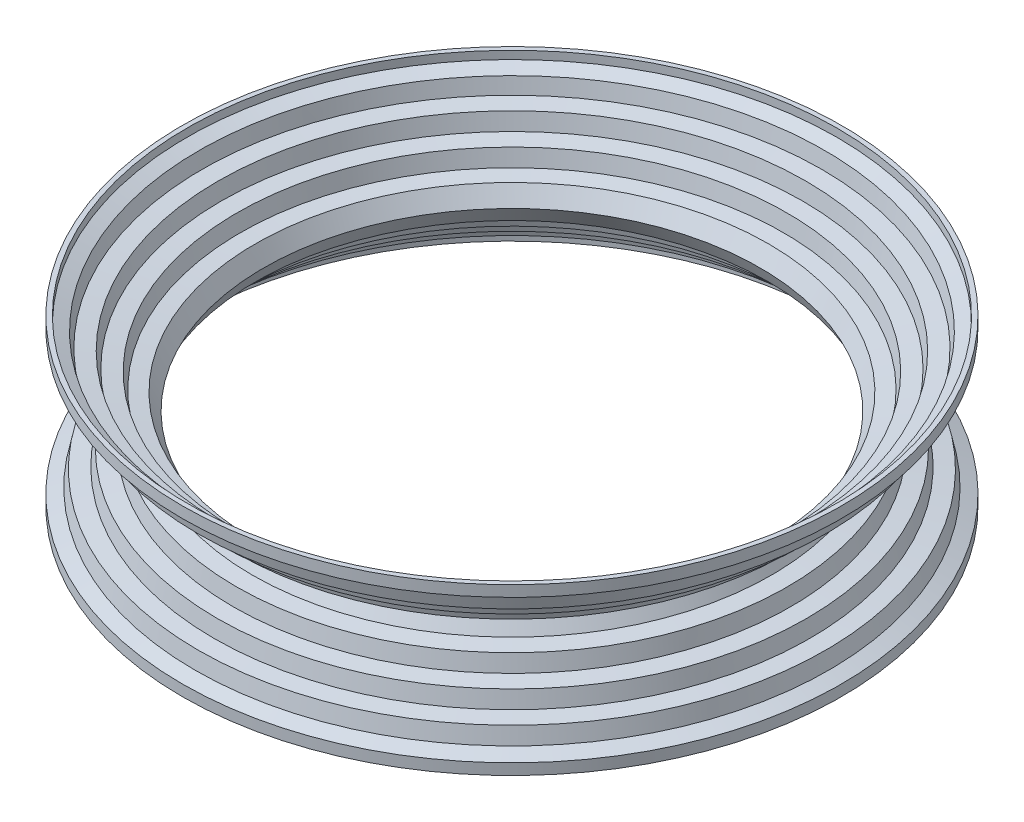
ISO-10303-21;
HEADER;
FILE_DESCRIPTION(('STEP AP214'),'2;1');
FILE_NAME('part.step','',(''),(''),'','','');
FILE_SCHEMA(('AUTOMOTIVE_DESIGN { 1 0 10303 214 1 1 1 1 }'));
ENDSEC;
DATA;
#1=APPLICATION_CONTEXT('core data for automotive mechanical design processes');
#2=APPLICATION_PROTOCOL_DEFINITION('international standard','automotive_design',2000,#1);
#3=PRODUCT_CONTEXT('',#1,'mechanical');
#4=PRODUCT('Part','Part','',(#3));
#5=PRODUCT_RELATED_PRODUCT_CATEGORY('part','',(#4));
#6=PRODUCT_DEFINITION_FORMATION('','',#4);
#7=PRODUCT_DEFINITION_CONTEXT('part definition',#1,'design');
#8=PRODUCT_DEFINITION('design','',#6,#7);
#9=PRODUCT_DEFINITION_SHAPE('','',#8);
#10=(LENGTH_UNIT() NAMED_UNIT(*) SI_UNIT(.MILLI.,.METRE.));
#11=(NAMED_UNIT(*) PLANE_ANGLE_UNIT() SI_UNIT($,.RADIAN.));
#12=(NAMED_UNIT(*) SI_UNIT($,.STERADIAN.) SOLID_ANGLE_UNIT());
#13=UNCERTAINTY_MEASURE_WITH_UNIT(LENGTH_MEASURE(1.E-05),#10,'distance_accuracy_value','');
#14=(GEOMETRIC_REPRESENTATION_CONTEXT(3) GLOBAL_UNCERTAINTY_ASSIGNED_CONTEXT((#13)) GLOBAL_UNIT_ASSIGNED_CONTEXT((#10,
#11,#12)) REPRESENTATION_CONTEXT('',''));
#15=CARTESIAN_POINT('',(0.,0.,0.));
#16=DIRECTION('',(0.,0.,1.));
#17=DIRECTION('',(1.,0.,0.));
#18=AXIS2_PLACEMENT_3D('',#15,#16,#17);
#19=CARTESIAN_POINT('',(0.,1.2,0.));
#20=DIRECTION('',(0.,-1.,0.));
#21=DIRECTION('',(0.,0.,-1.));
#22=AXIS2_PLACEMENT_3D('',#19,#20,#21);
#23=CYLINDRICAL_SURFACE('',#22,35.8938037049019);
#24=CARTESIAN_POINT('',(0.,1.2,0.));
#25=DIRECTION('',(0.,1.,0.));
#26=DIRECTION('',(0.,0.,1.));
#27=AXIS2_PLACEMENT_3D('',#24,#25,#26);
#28=CIRCLE('',#27,35.8938037049019);
#29=CARTESIAN_POINT('',(0.,1.2,35.8938037049019));
#30=VERTEX_POINT('',#29);
#31=EDGE_CURVE('E10',#30,#30,#28,.T.);
#32=ORIENTED_EDGE('',*,*,#31,.F.);
#33=EDGE_LOOP('',(#32));
#34=FACE_BOUND('',#33,.T.);
#35=CARTESIAN_POINT('',(0.,0.,0.));
#36=DIRECTION('',(0.,1.,0.));
#37=DIRECTION('',(0.,0.,1.));
#38=AXIS2_PLACEMENT_3D('',#35,#36,#37);
#39=CIRCLE('',#38,35.8938037049019);
#40=CARTESIAN_POINT('',(0.,0.,35.8938037049019));
#41=VERTEX_POINT('',#40);
#42=EDGE_CURVE('E42',#41,#41,#39,.T.);
#43=ORIENTED_EDGE('',*,*,#42,.T.);
#44=EDGE_LOOP('',(#43));
#45=FACE_BOUND('',#44,.T.);
#46=ADVANCED_FACE('F39',(#34,#45),#23,.T.);
#47=CARTESIAN_POINT('',(0.,0.,0.));
#48=DIRECTION('',(0.,1.,0.));
#49=DIRECTION('',(0.,0.,1.));
#50=AXIS2_PLACEMENT_3D('',#47,#48,#49);
#51=PLANE('',#50);
#52=CARTESIAN_POINT('',(0.,0.,0.));
#53=DIRECTION('',(0.,1.,0.));
#54=DIRECTION('',(0.,0.,1.));
#55=AXIS2_PLACEMENT_3D('',#52,#53,#54);
#56=CIRCLE('',#55,35.3938037049019);
#57=CARTESIAN_POINT('',(0.,0.,35.3938037049019));
#58=VERTEX_POINT('',#57);
#59=EDGE_CURVE('E127',#58,#58,#56,.T.);
#60=ORIENTED_EDGE('',*,*,#59,.T.);
#61=EDGE_LOOP('',(#60));
#62=FACE_BOUND('',#61,.T.);
#63=ORIENTED_EDGE('',*,*,#42,.F.);
#64=EDGE_LOOP('',(#63));
#65=FACE_BOUND('',#64,.T.);
#66=ADVANCED_FACE('F217',(#62,#65),#51,.F.);
#67=CARTESIAN_POINT('',(0.,7.66437557558971,0.));
#68=DIRECTION('',(0.,-1.,0.));
#69=DIRECTION('',(0.,0.,-1.));
#70=AXIS2_PLACEMENT_3D('',#67,#68,#69);
#71=CONICAL_SURFACE('',#70,28.2804947385116,0.479292018710361);
#72=CARTESIAN_POINT('',(0.,9.,0.));
#73=DIRECTION('',(0.,1.,0.));
#74=DIRECTION('',(0.,0.,1.));
#75=AXIS2_PLACEMENT_3D('',#72,#73,#74);
#76=CIRCLE('',#75,27.5863556243945);
#77=CARTESIAN_POINT('',(0.,9.,27.5863556243945));
#78=VERTEX_POINT('',#77);
#79=EDGE_CURVE('E80',#78,#78,#76,.T.);
#80=ORIENTED_EDGE('',*,*,#79,.F.);
#81=EDGE_LOOP('',(#80));
#82=FACE_BOUND('',#81,.T.);
#83=CARTESIAN_POINT('',(0.,7.66437557558971,0.));
#84=DIRECTION('',(0.,1.,0.));
#85=DIRECTION('',(0.,0.,1.));
#86=AXIS2_PLACEMENT_3D('',#83,#84,#85);
#87=CIRCLE('',#86,28.2804947385116);
#88=CARTESIAN_POINT('',(0.,7.66437557558971,28.2804947385116));
#89=VERTEX_POINT('',#88);
#90=EDGE_CURVE('E51',#89,#89,#87,.T.);
#91=ORIENTED_EDGE('',*,*,#90,.T.);
#92=EDGE_LOOP('',(#91));
#93=FACE_BOUND('',#92,.T.);
#94=ADVANCED_FACE('F222',(#82,#93),#71,.T.);
#95=CARTESIAN_POINT('',(0.,7.41775083455298,0.));
#96=DIRECTION('',(0.,-1.,0.));
#97=DIRECTION('',(0.,0.,-1.));
#98=AXIS2_PLACEMENT_3D('',#95,#96,#97);
#99=CONICAL_SURFACE('',#98,30.0038058645444,1.42865052237282);
#100=ORIENTED_EDGE('',*,*,#90,.F.);
#101=EDGE_LOOP('',(#100));
#102=FACE_BOUND('',#101,.T.);
#103=CARTESIAN_POINT('',(0.,7.41775083455298,0.));
#104=DIRECTION('',(0.,1.,0.));
#105=DIRECTION('',(0.,0.,1.));
#106=AXIS2_PLACEMENT_3D('',#103,#104,#105);
#107=CIRCLE('',#106,30.0038058645444);
#108=CARTESIAN_POINT('',(0.,7.41775083455298,30.0038058645444));
#109=VERTEX_POINT('',#108);
#110=EDGE_CURVE('E56',#109,#109,#107,.T.);
#111=ORIENTED_EDGE('',*,*,#110,.T.);
#112=EDGE_LOOP('',(#111));
#113=FACE_BOUND('',#112,.T.);
#114=ADVANCED_FACE('F230',(#102,#113),#99,.T.);
#115=CARTESIAN_POINT('',(0.,5.71327920479853,0.));
#116=DIRECTION('',(0.,-1.,0.));
#117=DIRECTION('',(0.,0.,-1.));
#118=AXIS2_PLACEMENT_3D('',#115,#116,#117);
#119=CONICAL_SURFACE('',#118,30.3579265549343,0.204845653503479);
#120=ORIENTED_EDGE('',*,*,#110,.F.);
#121=EDGE_LOOP('',(#120));
#122=FACE_BOUND('',#121,.T.);
#123=CARTESIAN_POINT('',(0.,5.71327920479853,0.));
#124=DIRECTION('',(0.,1.,0.));
#125=DIRECTION('',(0.,0.,1.));
#126=AXIS2_PLACEMENT_3D('',#123,#124,#125);
#127=CIRCLE('',#126,30.3579265549343);
#128=CARTESIAN_POINT('',(0.,5.71327920479853,30.3579265549343));
#129=VERTEX_POINT('',#128);
#130=EDGE_CURVE('E60',#129,#129,#127,.T.);
#131=ORIENTED_EDGE('',*,*,#130,.T.);
#132=EDGE_LOOP('',(#131));
#133=FACE_BOUND('',#132,.T.);
#134=ADVANCED_FACE('F236',(#122,#133),#119,.T.);
#135=CARTESIAN_POINT('',(0.,5.4666544637618,0.));
#136=DIRECTION('',(0.,-1.,0.));
#137=DIRECTION('',(0.,0.,-1.));
#138=AXIS2_PLACEMENT_3D('',#135,#136,#137);
#139=CONICAL_SURFACE('',#138,32.0812376809672,1.42865052237281);
#140=ORIENTED_EDGE('',*,*,#130,.F.);
#141=EDGE_LOOP('',(#140));
#142=FACE_BOUND('',#141,.T.);
#143=CARTESIAN_POINT('',(0.,5.4666544637618,0.));
#144=DIRECTION('',(0.,1.,0.));
#145=DIRECTION('',(0.,0.,1.));
#146=AXIS2_PLACEMENT_3D('',#143,#144,#145);
#147=CIRCLE('',#146,32.0812376809672);
#148=CARTESIAN_POINT('',(0.,5.4666544637618,32.0812376809672));
#149=VERTEX_POINT('',#148);
#150=EDGE_CURVE('E64',#149,#149,#147,.T.);
#151=ORIENTED_EDGE('',*,*,#150,.T.);
#152=EDGE_LOOP('',(#151));
#153=FACE_BOUND('',#152,.T.);
#154=ADVANCED_FACE('F240',(#142,#153),#139,.T.);
#155=CARTESIAN_POINT('',(0.,3.76218283400735,0.));
#156=DIRECTION('',(0.,-1.,0.));
#157=DIRECTION('',(0.,0.,-1.));
#158=AXIS2_PLACEMENT_3D('',#155,#156,#157);
#159=CONICAL_SURFACE('',#158,32.4353583713571,0.204845653503481);
#160=ORIENTED_EDGE('',*,*,#150,.F.);
#161=EDGE_LOOP('',(#160));
#162=FACE_BOUND('',#161,.T.);
#163=CARTESIAN_POINT('',(0.,3.76218283400735,0.));
#164=DIRECTION('',(0.,1.,0.));
#165=DIRECTION('',(0.,0.,1.));
#166=AXIS2_PLACEMENT_3D('',#163,#164,#165);
#167=CIRCLE('',#166,32.4353583713571);
#168=CARTESIAN_POINT('',(0.,3.76218283400735,32.4353583713571));
#169=VERTEX_POINT('',#168);
#170=EDGE_CURVE('E68',#169,#169,#167,.T.);
#171=ORIENTED_EDGE('',*,*,#170,.T.);
#172=EDGE_LOOP('',(#171));
#173=FACE_BOUND('',#172,.T.);
#174=ADVANCED_FACE('F244',(#162,#173),#159,.T.);
#175=CARTESIAN_POINT('',(0.,3.51555809297061,0.));
#176=DIRECTION('',(0.,-1.,0.));
#177=DIRECTION('',(0.,0.,-1.));
#178=AXIS2_PLACEMENT_3D('',#175,#176,#177);
#179=CONICAL_SURFACE('',#178,34.1586694973899,1.42865052237281);
#180=ORIENTED_EDGE('',*,*,#170,.F.);
#181=EDGE_LOOP('',(#180));
#182=FACE_BOUND('',#181,.T.);
#183=CARTESIAN_POINT('',(0.,3.51555809297061,0.));
#184=DIRECTION('',(0.,1.,0.));
#185=DIRECTION('',(0.,0.,1.));
#186=AXIS2_PLACEMENT_3D('',#183,#184,#185);
#187=CIRCLE('',#186,34.1586694973899);
#188=CARTESIAN_POINT('',(0.,3.51555809297061,34.1586694973899));
#189=VERTEX_POINT('',#188);
#190=EDGE_CURVE('E72',#189,#189,#187,.T.);
#191=ORIENTED_EDGE('',*,*,#190,.T.);
#192=EDGE_LOOP('',(#191));
#193=FACE_BOUND('',#192,.T.);
#194=ADVANCED_FACE('F248',(#182,#193),#179,.T.);
#195=CARTESIAN_POINT('',(0.,1.81108646321617,0.));
#196=DIRECTION('',(0.,-1.,0.));
#197=DIRECTION('',(0.,0.,-1.));
#198=AXIS2_PLACEMENT_3D('',#195,#196,#197);
#199=CONICAL_SURFACE('',#198,34.5127901877798,0.204845653503478);
#200=ORIENTED_EDGE('',*,*,#190,.F.);
#201=EDGE_LOOP('',(#200));
#202=FACE_BOUND('',#201,.T.);
#203=CARTESIAN_POINT('',(0.,1.81108646321617,0.));
#204=DIRECTION('',(0.,1.,0.));
#205=DIRECTION('',(0.,0.,1.));
#206=AXIS2_PLACEMENT_3D('',#203,#204,#205);
#207=CIRCLE('',#206,34.5127901877798);
#208=CARTESIAN_POINT('',(0.,1.81108646321617,34.5127901877798));
#209=VERTEX_POINT('',#208);
#210=EDGE_CURVE('E76',#209,#209,#207,.T.);
#211=ORIENTED_EDGE('',*,*,#210,.T.);
#212=EDGE_LOOP('',(#211));
#213=FACE_BOUND('',#212,.T.);
#214=ADVANCED_FACE('F252',(#202,#213),#199,.T.);
#215=CARTESIAN_POINT('',(0.,1.2,0.));
#216=DIRECTION('',(0.,-1.,0.));
#217=DIRECTION('',(0.,0.,-1.));
#218=AXIS2_PLACEMENT_3D('',#215,#216,#217);
#219=CONICAL_SURFACE('',#218,35.8938037049019,1.15420415716593);
#220=ORIENTED_EDGE('',*,*,#210,.F.);
#221=EDGE_LOOP('',(#220));
#222=FACE_BOUND('',#221,.T.);
#223=ORIENTED_EDGE('',*,*,#31,.T.);
#224=EDGE_LOOP('',(#223));
#225=FACE_BOUND('',#224,.T.);
#226=ADVANCED_FACE('F256',(#222,#225),#219,.T.);
#227=CARTESIAN_POINT('',(0.,16.8,0.));
#228=DIRECTION('',(0.,1.,0.));
#229=DIRECTION('',(0.,0.,-1.));
#230=AXIS2_PLACEMENT_3D('',#227,#228,#229);
#231=CYLINDRICAL_SURFACE('',#230,35.8938037049019);
#232=CARTESIAN_POINT('',(0.,16.8,0.));
#233=DIRECTION('',(0.,1.,0.));
#234=DIRECTION('',(0.,0.,1.));
#235=AXIS2_PLACEMENT_3D('',#232,#233,#234);
#236=CIRCLE('',#235,35.8938037049019);
#237=CARTESIAN_POINT('',(0.,16.8,35.8938037049019));
#238=VERTEX_POINT('',#237);
#239=EDGE_CURVE('E84',#238,#238,#236,.T.);
#240=ORIENTED_EDGE('',*,*,#239,.T.);
#241=EDGE_LOOP('',(#240));
#242=FACE_BOUND('',#241,.T.);
#243=CARTESIAN_POINT('',(0.,18.,0.));
#244=DIRECTION('',(0.,1.,0.));
#245=DIRECTION('',(0.,0.,1.));
#246=AXIS2_PLACEMENT_3D('',#243,#244,#245);
#247=CIRCLE('',#246,35.8938037049019);
#248=CARTESIAN_POINT('',(0.,18.,35.8938037049019));
#249=VERTEX_POINT('',#248);
#250=EDGE_CURVE('E85',#249,#249,#247,.T.);
#251=ORIENTED_EDGE('',*,*,#250,.F.);
#252=EDGE_LOOP('',(#251));
#253=FACE_BOUND('',#252,.T.);
#254=ADVANCED_FACE('F260',(#242,#253),#231,.T.);
#255=CARTESIAN_POINT('',(0.,18.,0.));
#256=DIRECTION('',(0.,-1.,0.));
#257=DIRECTION('',(0.,0.,1.));
#258=AXIS2_PLACEMENT_3D('',#255,#256,#257);
#259=PLANE('',#258);
#260=CARTESIAN_POINT('',(0.,18.,0.));
#261=DIRECTION('',(0.,-1.,0.));
#262=DIRECTION('',(0.,0.,-1.));
#263=AXIS2_PLACEMENT_3D('',#260,#261,#262);
#264=CIRCLE('',#263,35.3938037049019);
#265=CARTESIAN_POINT('',(0.,18.,-35.3938037049019));
#266=VERTEX_POINT('',#265);
#267=EDGE_CURVE('E121',#266,#266,#264,.F.);
#268=ORIENTED_EDGE('',*,*,#267,.F.);
#269=EDGE_LOOP('',(#268));
#270=FACE_BOUND('',#269,.T.);
#271=ORIENTED_EDGE('',*,*,#250,.T.);
#272=EDGE_LOOP('',(#271));
#273=FACE_BOUND('',#272,.T.);
#274=ADVANCED_FACE('F264',(#270,#273),#259,.F.);
#275=CARTESIAN_POINT('',(0.,10.3356244244103,0.));
#276=DIRECTION('',(0.,1.,0.));
#277=DIRECTION('',(0.,0.,-1.));
#278=AXIS2_PLACEMENT_3D('',#275,#276,#277);
#279=CONICAL_SURFACE('',#278,28.2804947385116,0.479292018710361);
#280=ORIENTED_EDGE('',*,*,#79,.T.);
#281=EDGE_LOOP('',(#280));
#282=FACE_BOUND('',#281,.T.);
#283=CARTESIAN_POINT('',(0.,10.3356244244103,0.));
#284=DIRECTION('',(0.,1.,0.));
#285=DIRECTION('',(0.,0.,1.));
#286=AXIS2_PLACEMENT_3D('',#283,#284,#285);
#287=CIRCLE('',#286,28.2804947385116);
#288=CARTESIAN_POINT('',(0.,10.3356244244103,28.2804947385116));
#289=VERTEX_POINT('',#288);
#290=EDGE_CURVE('E89',#289,#289,#287,.T.);
#291=ORIENTED_EDGE('',*,*,#290,.F.);
#292=EDGE_LOOP('',(#291));
#293=FACE_BOUND('',#292,.T.);
#294=ADVANCED_FACE('F268',(#282,#293),#279,.T.);
#295=CARTESIAN_POINT('',(0.,10.582249165447,0.));
#296=DIRECTION('',(0.,1.,0.));
#297=DIRECTION('',(0.,0.,-1.));
#298=AXIS2_PLACEMENT_3D('',#295,#296,#297);
#299=CONICAL_SURFACE('',#298,30.0038058645444,1.42865052237282);
#300=ORIENTED_EDGE('',*,*,#290,.T.);
#301=EDGE_LOOP('',(#300));
#302=FACE_BOUND('',#301,.T.);
#303=CARTESIAN_POINT('',(0.,10.582249165447,0.));
#304=DIRECTION('',(0.,1.,0.));
#305=DIRECTION('',(0.,0.,1.));
#306=AXIS2_PLACEMENT_3D('',#303,#304,#305);
#307=CIRCLE('',#306,30.0038058645444);
#308=CARTESIAN_POINT('',(0.,10.582249165447,30.0038058645444));
#309=VERTEX_POINT('',#308);
#310=EDGE_CURVE('E96',#309,#309,#307,.T.);
#311=ORIENTED_EDGE('',*,*,#310,.F.);
#312=EDGE_LOOP('',(#311));
#313=FACE_BOUND('',#312,.T.);
#314=ADVANCED_FACE('F272',(#302,#313),#299,.T.);
#315=CARTESIAN_POINT('',(0.,12.2867207952015,0.));
#316=DIRECTION('',(0.,1.,0.));
#317=DIRECTION('',(0.,0.,-1.));
#318=AXIS2_PLACEMENT_3D('',#315,#316,#317);
#319=CONICAL_SURFACE('',#318,30.3579265549343,0.204845653503479);
#320=ORIENTED_EDGE('',*,*,#310,.T.);
#321=EDGE_LOOP('',(#320));
#322=FACE_BOUND('',#321,.T.);
#323=CARTESIAN_POINT('',(0.,12.2867207952015,0.));
#324=DIRECTION('',(0.,1.,0.));
#325=DIRECTION('',(0.,0.,1.));
#326=AXIS2_PLACEMENT_3D('',#323,#324,#325);
#327=CIRCLE('',#326,30.3579265549343);
#328=CARTESIAN_POINT('',(0.,12.2867207952015,30.3579265549343));
#329=VERTEX_POINT('',#328);
#330=EDGE_CURVE('E100',#329,#329,#327,.T.);
#331=ORIENTED_EDGE('',*,*,#330,.F.);
#332=EDGE_LOOP('',(#331));
#333=FACE_BOUND('',#332,.T.);
#334=ADVANCED_FACE('F276',(#322,#333),#319,.T.);
#335=CARTESIAN_POINT('',(0.,12.5333455362382,0.));
#336=DIRECTION('',(0.,1.,0.));
#337=DIRECTION('',(0.,0.,-1.));
#338=AXIS2_PLACEMENT_3D('',#335,#336,#337);
#339=CONICAL_SURFACE('',#338,32.0812376809672,1.42865052237281);
#340=ORIENTED_EDGE('',*,*,#330,.T.);
#341=EDGE_LOOP('',(#340));
#342=FACE_BOUND('',#341,.T.);
#343=CARTESIAN_POINT('',(0.,12.5333455362382,0.));
#344=DIRECTION('',(0.,1.,0.));
#345=DIRECTION('',(0.,0.,1.));
#346=AXIS2_PLACEMENT_3D('',#343,#344,#345);
#347=CIRCLE('',#346,32.0812376809672);
#348=CARTESIAN_POINT('',(0.,12.5333455362382,32.0812376809672));
#349=VERTEX_POINT('',#348);
#350=EDGE_CURVE('E104',#349,#349,#347,.T.);
#351=ORIENTED_EDGE('',*,*,#350,.F.);
#352=EDGE_LOOP('',(#351));
#353=FACE_BOUND('',#352,.T.);
#354=ADVANCED_FACE('F280',(#342,#353),#339,.T.);
#355=CARTESIAN_POINT('',(0.,14.2378171659927,0.));
#356=DIRECTION('',(0.,1.,0.));
#357=DIRECTION('',(0.,0.,-1.));
#358=AXIS2_PLACEMENT_3D('',#355,#356,#357);
#359=CONICAL_SURFACE('',#358,32.4353583713571,0.204845653503481);
#360=ORIENTED_EDGE('',*,*,#350,.T.);
#361=EDGE_LOOP('',(#360));
#362=FACE_BOUND('',#361,.T.);
#363=CARTESIAN_POINT('',(0.,14.2378171659927,0.));
#364=DIRECTION('',(0.,1.,0.));
#365=DIRECTION('',(0.,0.,1.));
#366=AXIS2_PLACEMENT_3D('',#363,#364,#365);
#367=CIRCLE('',#366,32.4353583713571);
#368=CARTESIAN_POINT('',(0.,14.2378171659927,32.4353583713571));
#369=VERTEX_POINT('',#368);
#370=EDGE_CURVE('E108',#369,#369,#367,.T.);
#371=ORIENTED_EDGE('',*,*,#370,.F.);
#372=EDGE_LOOP('',(#371));
#373=FACE_BOUND('',#372,.T.);
#374=ADVANCED_FACE('F284',(#362,#373),#359,.T.);
#375=CARTESIAN_POINT('',(0.,14.4844419070294,0.));
#376=DIRECTION('',(0.,1.,0.));
#377=DIRECTION('',(0.,0.,-1.));
#378=AXIS2_PLACEMENT_3D('',#375,#376,#377);
#379=CONICAL_SURFACE('',#378,34.1586694973899,1.42865052237281);
#380=ORIENTED_EDGE('',*,*,#370,.T.);
#381=EDGE_LOOP('',(#380));
#382=FACE_BOUND('',#381,.T.);
#383=CARTESIAN_POINT('',(0.,14.4844419070294,0.));
#384=DIRECTION('',(0.,1.,0.));
#385=DIRECTION('',(0.,0.,1.));
#386=AXIS2_PLACEMENT_3D('',#383,#384,#385);
#387=CIRCLE('',#386,34.1586694973899);
#388=CARTESIAN_POINT('',(0.,14.4844419070294,34.1586694973899));
#389=VERTEX_POINT('',#388);
#390=EDGE_CURVE('E112',#389,#389,#387,.T.);
#391=ORIENTED_EDGE('',*,*,#390,.F.);
#392=EDGE_LOOP('',(#391));
#393=FACE_BOUND('',#392,.T.);
#394=ADVANCED_FACE('F288',(#382,#393),#379,.T.);
#395=CARTESIAN_POINT('',(0.,16.1889135367838,0.));
#396=DIRECTION('',(0.,1.,0.));
#397=DIRECTION('',(0.,0.,-1.));
#398=AXIS2_PLACEMENT_3D('',#395,#396,#397);
#399=CONICAL_SURFACE('',#398,34.5127901877798,0.204845653503478);
#400=ORIENTED_EDGE('',*,*,#390,.T.);
#401=EDGE_LOOP('',(#400));
#402=FACE_BOUND('',#401,.T.);
#403=CARTESIAN_POINT('',(0.,16.1889135367838,0.));
#404=DIRECTION('',(0.,1.,0.));
#405=DIRECTION('',(0.,0.,1.));
#406=AXIS2_PLACEMENT_3D('',#403,#404,#405);
#407=CIRCLE('',#406,34.5127901877798);
#408=CARTESIAN_POINT('',(0.,16.1889135367838,34.5127901877798));
#409=VERTEX_POINT('',#408);
#410=EDGE_CURVE('E116',#409,#409,#407,.T.);
#411=ORIENTED_EDGE('',*,*,#410,.F.);
#412=EDGE_LOOP('',(#411));
#413=FACE_BOUND('',#412,.T.);
#414=ADVANCED_FACE('F292',(#402,#413),#399,.T.);
#415=CARTESIAN_POINT('',(0.,16.8,0.));
#416=DIRECTION('',(0.,1.,0.));
#417=DIRECTION('',(0.,0.,-1.));
#418=AXIS2_PLACEMENT_3D('',#415,#416,#417);
#419=CONICAL_SURFACE('',#418,35.8938037049019,1.15420415716593);
#420=ORIENTED_EDGE('',*,*,#410,.T.);
#421=EDGE_LOOP('',(#420));
#422=FACE_BOUND('',#421,.T.);
#423=ORIENTED_EDGE('',*,*,#239,.F.);
#424=EDGE_LOOP('',(#423));
#425=FACE_BOUND('',#424,.T.);
#426=ADVANCED_FACE('F296',(#422,#425),#419,.T.);
#427=CARTESIAN_POINT('',(0.,1.2,0.));
#428=DIRECTION('',(0.,-1.,0.));
#429=DIRECTION('',(0.,0.,-1.));
#430=AXIS2_PLACEMENT_3D('',#427,#428,#429);
#431=CYLINDRICAL_SURFACE('',#430,35.3938037049019);
#432=CARTESIAN_POINT('',(0.,0.87448277779665,0.));
#433=DIRECTION('',(0.,-1.,0.));
#434=DIRECTION('',(0.,0.,-1.));
#435=AXIS2_PLACEMENT_3D('',#432,#433,#434);
#436=CIRCLE('',#435,35.3938037049019);
#437=CARTESIAN_POINT('',(0.,0.87448277779665,-35.3938037049019));
#438=VERTEX_POINT('',#437);
#439=EDGE_CURVE('E120',#438,#438,#436,.F.);
#440=ORIENTED_EDGE('',*,*,#439,.T.);
#441=EDGE_LOOP('',(#440));
#442=FACE_BOUND('',#441,.T.);
#443=ORIENTED_EDGE('',*,*,#59,.F.);
#444=EDGE_LOOP('',(#443));
#445=FACE_BOUND('',#444,.T.);
#446=ADVANCED_FACE('F197',(#442,#445),#431,.F.);
#447=CARTESIAN_POINT('',(0.,7.43380003356266,0.));
#448=DIRECTION('',(0.,-1.,0.));
#449=DIRECTION('',(0.,0.,-1.));
#450=AXIS2_PLACEMENT_3D('',#447,#448,#449);
#451=CONICAL_SURFACE('',#450,27.8368339227763,0.479292018710361);
#452=CARTESIAN_POINT('',(0.,8.99999999999999,0.));
#453=DIRECTION('',(0.,1.,0.));
#454=DIRECTION('',(0.,0.,1.));
#455=AXIS2_PLACEMENT_3D('',#452,#453,#454);
#456=CIRCLE('',#455,27.0228620925494);
#457=CARTESIAN_POINT('',(0.,8.99999999999999,27.0228620925494));
#458=VERTEX_POINT('',#457);
#459=EDGE_CURVE('E135',#458,#458,#456,.T.);
#460=ORIENTED_EDGE('',*,*,#459,.T.);
#461=EDGE_LOOP('',(#460));
#462=FACE_BOUND('',#461,.T.);
#463=CARTESIAN_POINT('',(0.,7.20581755785108,0.));
#464=DIRECTION('',(0.,1.,0.));
#465=DIRECTION('',(0.,0.,1.));
#466=AXIS2_PLACEMENT_3D('',#463,#464,#465);
#467=CIRCLE('',#466,27.9553189930044);
#468=CARTESIAN_POINT('',(0.,7.20581755785108,27.9553189930044));
#469=VERTEX_POINT('',#468);
#470=EDGE_CURVE('E131',#469,#469,#467,.T.);
#471=ORIENTED_EDGE('',*,*,#470,.F.);
#472=EDGE_LOOP('',(#471));
#473=FACE_BOUND('',#472,.T.);
#474=ADVANCED_FACE('F356',(#462,#473),#451,.F.);
#475=CARTESIAN_POINT('',(0.,6.92279369230417,0.));
#476=DIRECTION('',(0.,-1.,0.));
#477=DIRECTION('',(0.,0.,-1.));
#478=AXIS2_PLACEMENT_3D('',#475,#476,#477);
#479=CONICAL_SURFACE('',#478,29.9329720637366,1.42865052237282);
#480=ORIENTED_EDGE('',*,*,#470,.T.);
#481=EDGE_LOOP('',(#480));
#482=FACE_BOUND('',#481,.T.);
#483=CARTESIAN_POINT('',(0.,6.97250162269566,0.));
#484=DIRECTION('',(0.,1.,0.));
#485=DIRECTION('',(0.,0.,1.));
#486=AXIS2_PLACEMENT_3D('',#483,#484,#485);
#487=CIRCLE('',#486,29.5856337182988);
#488=CARTESIAN_POINT('',(0.,6.97250162269566,29.5856337182988));
#489=VERTEX_POINT('',#488);
#490=EDGE_CURVE('E170',#489,#489,#487,.T.);
#491=ORIENTED_EDGE('',*,*,#490,.F.);
#492=EDGE_LOOP('',(#491));
#493=FACE_BOUND('',#492,.T.);
#494=ADVANCED_FACE('F359',(#482,#493),#479,.F.);
#495=CARTESIAN_POINT('',(0.,5.61157118337465,0.));
#496=DIRECTION('',(0.,-1.,0.));
#497=DIRECTION('',(0.,0.,-1.));
#498=AXIS2_PLACEMENT_3D('',#495,#496,#497);
#499=CONICAL_SURFACE('',#498,29.8683803585667,0.204845653503479);
#500=ORIENTED_EDGE('',*,*,#490,.T.);
#501=EDGE_LOOP('',(#500));
#502=FACE_BOUND('',#501,.T.);
#503=CARTESIAN_POINT('',(0.,5.26802999294121,0.));
#504=DIRECTION('',(0.,1.,0.));
#505=DIRECTION('',(0.,0.,1.));
#506=AXIS2_PLACEMENT_3D('',#503,#504,#505);
#507=CIRCLE('',#506,29.9397544086887);
#508=CARTESIAN_POINT('',(0.,5.26802999294121,29.9397544086887));
#509=VERTEX_POINT('',#508);
#510=EDGE_CURVE('E174',#509,#509,#507,.T.);
#511=ORIENTED_EDGE('',*,*,#510,.F.);
#512=EDGE_LOOP('',(#511));
#513=FACE_BOUND('',#512,.T.);
#514=ADVANCED_FACE('F365',(#502,#513),#499,.F.);
#515=CARTESIAN_POINT('',(0.,4.97169732151298,0.));
#516=DIRECTION('',(0.,-1.,0.));
#517=DIRECTION('',(0.,0.,-1.));
#518=AXIS2_PLACEMENT_3D('',#515,#516,#517);
#519=CONICAL_SURFACE('',#518,32.0104038801593,1.42865052237281);
#520=ORIENTED_EDGE('',*,*,#510,.T.);
#521=EDGE_LOOP('',(#520));
#522=FACE_BOUND('',#521,.T.);
#523=CARTESIAN_POINT('',(0.,5.02140525190447,0.));
#524=DIRECTION('',(0.,1.,0.));
#525=DIRECTION('',(0.,0.,1.));
#526=AXIS2_PLACEMENT_3D('',#523,#524,#525);
#527=CIRCLE('',#526,31.6630655347215);
#528=CARTESIAN_POINT('',(0.,5.02140525190447,31.6630655347215));
#529=VERTEX_POINT('',#528);
#530=EDGE_CURVE('E178',#529,#529,#527,.T.);
#531=ORIENTED_EDGE('',*,*,#530,.F.);
#532=EDGE_LOOP('',(#531));
#533=FACE_BOUND('',#532,.T.);
#534=ADVANCED_FACE('F371',(#522,#533),#519,.F.);
#535=CARTESIAN_POINT('',(0.,3.66047481258346,0.));
#536=DIRECTION('',(0.,-1.,0.));
#537=DIRECTION('',(0.,0.,-1.));
#538=AXIS2_PLACEMENT_3D('',#535,#536,#537);
#539=CONICAL_SURFACE('',#538,31.9458121749894,0.204845653503481);
#540=ORIENTED_EDGE('',*,*,#530,.T.);
#541=EDGE_LOOP('',(#540));
#542=FACE_BOUND('',#541,.T.);
#543=CARTESIAN_POINT('',(0.,3.31693362215002,0.));
#544=DIRECTION('',(0.,1.,0.));
#545=DIRECTION('',(0.,0.,1.));
#546=AXIS2_PLACEMENT_3D('',#543,#544,#545);
#547=CIRCLE('',#546,32.0171862251114);
#548=CARTESIAN_POINT('',(0.,3.31693362215002,32.0171862251114));
#549=VERTEX_POINT('',#548);
#550=EDGE_CURVE('E182',#549,#549,#547,.T.);
#551=ORIENTED_EDGE('',*,*,#550,.F.);
#552=EDGE_LOOP('',(#551));
#553=FACE_BOUND('',#552,.T.);
#554=ADVANCED_FACE('F377',(#542,#553),#539,.F.);
#555=CARTESIAN_POINT('',(0.,3.0206009507218,0.));
#556=DIRECTION('',(0.,-1.,0.));
#557=DIRECTION('',(0.,0.,-1.));
#558=AXIS2_PLACEMENT_3D('',#555,#556,#557);
#559=CONICAL_SURFACE('',#558,34.087835696582,1.42865052237281);
#560=ORIENTED_EDGE('',*,*,#550,.T.);
#561=EDGE_LOOP('',(#560));
#562=FACE_BOUND('',#561,.T.);
#563=CARTESIAN_POINT('',(0.,3.07030888111329,0.));
#564=DIRECTION('',(0.,1.,0.));
#565=DIRECTION('',(0.,0.,1.));
#566=AXIS2_PLACEMENT_3D('',#563,#564,#565);
#567=CIRCLE('',#566,33.7404973511443);
#568=CARTESIAN_POINT('',(0.,3.07030888111329,33.7404973511443));
#569=VERTEX_POINT('',#568);
#570=EDGE_CURVE('E186',#569,#569,#567,.T.);
#571=ORIENTED_EDGE('',*,*,#570,.F.);
#572=EDGE_LOOP('',(#571));
#573=FACE_BOUND('',#572,.T.);
#574=ADVANCED_FACE('F213',(#562,#573),#559,.F.);
#575=CARTESIAN_POINT('',(0.,1.70937844179229,0.));
#576=DIRECTION('',(0.,-1.,0.));
#577=DIRECTION('',(0.,0.,-1.));
#578=AXIS2_PLACEMENT_3D('',#575,#576,#577);
#579=CONICAL_SURFACE('',#578,34.0232439914121,0.204845653503478);
#580=ORIENTED_EDGE('',*,*,#570,.T.);
#581=EDGE_LOOP('',(#580));
#582=FACE_BOUND('',#581,.T.);
#583=CARTESIAN_POINT('',(0.,1.45781700146516,0.));
#584=DIRECTION('',(0.,1.,0.));
#585=DIRECTION('',(0.,0.,1.));
#586=AXIS2_PLACEMENT_3D('',#583,#584,#585);
#587=CIRCLE('',#586,34.075508346752);
#588=CARTESIAN_POINT('',(0.,1.45781700146516,34.075508346752));
#589=VERTEX_POINT('',#588);
#590=EDGE_CURVE('E166',#589,#589,#587,.T.);
#591=ORIENTED_EDGE('',*,*,#590,.F.);
#592=EDGE_LOOP('',(#591));
#593=FACE_BOUND('',#592,.T.);
#594=ADVANCED_FACE('F203',(#582,#593),#579,.F.);
#595=CARTESIAN_POINT('',(0.,0.742763392953796,0.));
#596=DIRECTION('',(0.,-1.,0.));
#597=DIRECTION('',(0.,0.,-1.));
#598=AXIS2_PLACEMENT_3D('',#595,#596,#597);
#599=CONICAL_SURFACE('',#598,35.6914804853326,1.15420415716593);
#600=ORIENTED_EDGE('',*,*,#590,.T.);
#601=EDGE_LOOP('',(#600));
#602=FACE_BOUND('',#601,.T.);
#603=ORIENTED_EDGE('',*,*,#439,.F.);
#604=EDGE_LOOP('',(#603));
#605=FACE_BOUND('',#604,.T.);
#606=ADVANCED_FACE('F200',(#602,#605),#599,.F.);
#607=CARTESIAN_POINT('',(0.,16.8,0.));
#608=DIRECTION('',(0.,1.,0.));
#609=DIRECTION('',(0.,0.,-1.));
#610=AXIS2_PLACEMENT_3D('',#607,#608,#609);
#611=CYLINDRICAL_SURFACE('',#610,35.3938037049019);
#612=CARTESIAN_POINT('',(0.,17.1255172222033,0.));
#613=DIRECTION('',(0.,1.,0.));
#614=DIRECTION('',(0.,0.,1.));
#615=AXIS2_PLACEMENT_3D('',#612,#613,#614);
#616=CIRCLE('',#615,35.3938037049019);
#617=CARTESIAN_POINT('',(0.,17.1255172222033,35.3938037049019));
#618=VERTEX_POINT('',#617);
#619=EDGE_CURVE('E125',#618,#618,#616,.T.);
#620=ORIENTED_EDGE('',*,*,#619,.F.);
#621=EDGE_LOOP('',(#620));
#622=FACE_BOUND('',#621,.T.);
#623=ORIENTED_EDGE('',*,*,#267,.T.);
#624=EDGE_LOOP('',(#623));
#625=FACE_BOUND('',#624,.T.);
#626=ADVANCED_FACE('F202',(#622,#625),#611,.F.);
#627=CARTESIAN_POINT('',(0.,10.5661999664373,0.));
#628=DIRECTION('',(0.,1.,0.));
#629=DIRECTION('',(0.,0.,-1.));
#630=AXIS2_PLACEMENT_3D('',#627,#628,#629);
#631=CONICAL_SURFACE('',#630,27.8368339227763,0.479292018710361);
#632=ORIENTED_EDGE('',*,*,#459,.F.);
#633=EDGE_LOOP('',(#632));
#634=FACE_BOUND('',#633,.T.);
#635=CARTESIAN_POINT('',(0.,10.7941824421489,0.));
#636=DIRECTION('',(0.,1.,0.));
#637=DIRECTION('',(0.,0.,1.));
#638=AXIS2_PLACEMENT_3D('',#635,#636,#637);
#639=CIRCLE('',#638,27.9553189930044);
#640=CARTESIAN_POINT('',(0.,10.7941824421489,27.9553189930044));
#641=VERTEX_POINT('',#640);
#642=EDGE_CURVE('E126',#641,#641,#639,.T.);
#643=ORIENTED_EDGE('',*,*,#642,.T.);
#644=EDGE_LOOP('',(#643));
#645=FACE_BOUND('',#644,.T.);
#646=ADVANCED_FACE('F210',(#634,#645),#631,.F.);
#647=CARTESIAN_POINT('',(0.,11.0772063076958,0.));
#648=DIRECTION('',(0.,1.,0.));
#649=DIRECTION('',(0.,0.,-1.));
#650=AXIS2_PLACEMENT_3D('',#647,#648,#649);
#651=CONICAL_SURFACE('',#650,29.9329720637366,1.42865052237282);
#652=ORIENTED_EDGE('',*,*,#642,.F.);
#653=EDGE_LOOP('',(#652));
#654=FACE_BOUND('',#653,.T.);
#655=CARTESIAN_POINT('',(0.,11.0274983773043,0.));
#656=DIRECTION('',(0.,1.,0.));
#657=DIRECTION('',(0.,0.,1.));
#658=AXIS2_PLACEMENT_3D('',#655,#656,#657);
#659=CIRCLE('',#658,29.5856337182988);
#660=CARTESIAN_POINT('',(0.,11.0274983773043,29.5856337182988));
#661=VERTEX_POINT('',#660);
#662=EDGE_CURVE('E156',#661,#661,#659,.T.);
#663=ORIENTED_EDGE('',*,*,#662,.T.);
#664=EDGE_LOOP('',(#663));
#665=FACE_BOUND('',#664,.T.);
#666=ADVANCED_FACE('F324',(#654,#665),#651,.F.);
#667=CARTESIAN_POINT('',(0.,12.3884288166253,0.));
#668=DIRECTION('',(0.,1.,0.));
#669=DIRECTION('',(0.,0.,-1.));
#670=AXIS2_PLACEMENT_3D('',#667,#668,#669);
#671=CONICAL_SURFACE('',#670,29.8683803585667,0.204845653503479);
#672=ORIENTED_EDGE('',*,*,#662,.F.);
#673=EDGE_LOOP('',(#672));
#674=FACE_BOUND('',#673,.T.);
#675=CARTESIAN_POINT('',(0.,12.7319700070588,0.));
#676=DIRECTION('',(0.,1.,0.));
#677=DIRECTION('',(0.,0.,1.));
#678=AXIS2_PLACEMENT_3D('',#675,#676,#677);
#679=CIRCLE('',#678,29.9397544086887);
#680=CARTESIAN_POINT('',(0.,12.7319700070588,29.9397544086887));
#681=VERTEX_POINT('',#680);
#682=EDGE_CURVE('E152',#681,#681,#679,.T.);
#683=ORIENTED_EDGE('',*,*,#682,.T.);
#684=EDGE_LOOP('',(#683));
#685=FACE_BOUND('',#684,.T.);
#686=ADVANCED_FACE('F320',(#674,#685),#671,.F.);
#687=CARTESIAN_POINT('',(0.,13.028302678487,0.));
#688=DIRECTION('',(0.,1.,0.));
#689=DIRECTION('',(0.,0.,-1.));
#690=AXIS2_PLACEMENT_3D('',#687,#688,#689);
#691=CONICAL_SURFACE('',#690,32.0104038801593,1.42865052237281);
#692=ORIENTED_EDGE('',*,*,#682,.F.);
#693=EDGE_LOOP('',(#692));
#694=FACE_BOUND('',#693,.T.);
#695=CARTESIAN_POINT('',(0.,12.9785947480955,0.));
#696=DIRECTION('',(0.,1.,0.));
#697=DIRECTION('',(0.,0.,1.));
#698=AXIS2_PLACEMENT_3D('',#695,#696,#697);
#699=CIRCLE('',#698,31.6630655347215);
#700=CARTESIAN_POINT('',(0.,12.9785947480955,31.6630655347215));
#701=VERTEX_POINT('',#700);
#702=EDGE_CURVE('E148',#701,#701,#699,.T.);
#703=ORIENTED_EDGE('',*,*,#702,.T.);
#704=EDGE_LOOP('',(#703));
#705=FACE_BOUND('',#704,.T.);
#706=ADVANCED_FACE('F316',(#694,#705),#691,.F.);
#707=CARTESIAN_POINT('',(0.,14.3395251874165,0.));
#708=DIRECTION('',(0.,1.,0.));
#709=DIRECTION('',(0.,0.,-1.));
#710=AXIS2_PLACEMENT_3D('',#707,#708,#709);
#711=CONICAL_SURFACE('',#710,31.9458121749894,0.204845653503481);
#712=ORIENTED_EDGE('',*,*,#702,.F.);
#713=EDGE_LOOP('',(#712));
#714=FACE_BOUND('',#713,.T.);
#715=CARTESIAN_POINT('',(0.,14.68306637785,0.));
#716=DIRECTION('',(0.,1.,0.));
#717=DIRECTION('',(0.,0.,1.));
#718=AXIS2_PLACEMENT_3D('',#715,#716,#717);
#719=CIRCLE('',#718,32.0171862251114);
#720=CARTESIAN_POINT('',(0.,14.68306637785,32.0171862251114));
#721=VERTEX_POINT('',#720);
#722=EDGE_CURVE('E144',#721,#721,#719,.T.);
#723=ORIENTED_EDGE('',*,*,#722,.T.);
#724=EDGE_LOOP('',(#723));
#725=FACE_BOUND('',#724,.T.);
#726=ADVANCED_FACE('F312',(#714,#725),#711,.F.);
#727=CARTESIAN_POINT('',(0.,14.9793990492782,0.));
#728=DIRECTION('',(0.,1.,0.));
#729=DIRECTION('',(0.,0.,-1.));
#730=AXIS2_PLACEMENT_3D('',#727,#728,#729);
#731=CONICAL_SURFACE('',#730,34.087835696582,1.42865052237281);
#732=ORIENTED_EDGE('',*,*,#722,.F.);
#733=EDGE_LOOP('',(#732));
#734=FACE_BOUND('',#733,.T.);
#735=CARTESIAN_POINT('',(0.,14.9296911188867,0.));
#736=DIRECTION('',(0.,1.,0.));
#737=DIRECTION('',(0.,0.,1.));
#738=AXIS2_PLACEMENT_3D('',#735,#736,#737);
#739=CIRCLE('',#738,33.7404973511443);
#740=CARTESIAN_POINT('',(0.,14.9296911188867,33.7404973511443));
#741=VERTEX_POINT('',#740);
#742=EDGE_CURVE('E140',#741,#741,#739,.T.);
#743=ORIENTED_EDGE('',*,*,#742,.T.);
#744=EDGE_LOOP('',(#743));
#745=FACE_BOUND('',#744,.T.);
#746=ADVANCED_FACE('F308',(#734,#745),#731,.F.);
#747=CARTESIAN_POINT('',(0.,16.2906215582077,0.));
#748=DIRECTION('',(0.,1.,0.));
#749=DIRECTION('',(0.,0.,-1.));
#750=AXIS2_PLACEMENT_3D('',#747,#748,#749);
#751=CONICAL_SURFACE('',#750,34.0232439914121,0.204845653503478);
#752=ORIENTED_EDGE('',*,*,#742,.F.);
#753=EDGE_LOOP('',(#752));
#754=FACE_BOUND('',#753,.T.);
#755=CARTESIAN_POINT('',(0.,16.5421829985348,0.));
#756=DIRECTION('',(0.,1.,0.));
#757=DIRECTION('',(0.,0.,1.));
#758=AXIS2_PLACEMENT_3D('',#755,#756,#757);
#759=CIRCLE('',#758,34.075508346752);
#760=CARTESIAN_POINT('',(0.,16.5421829985348,34.075508346752));
#761=VERTEX_POINT('',#760);
#762=EDGE_CURVE('E136',#761,#761,#759,.T.);
#763=ORIENTED_EDGE('',*,*,#762,.T.);
#764=EDGE_LOOP('',(#763));
#765=FACE_BOUND('',#764,.T.);
#766=ADVANCED_FACE('F304',(#754,#765),#751,.F.);
#767=CARTESIAN_POINT('',(0.,17.2572366070462,0.));
#768=DIRECTION('',(0.,1.,0.));
#769=DIRECTION('',(0.,0.,-1.));
#770=AXIS2_PLACEMENT_3D('',#767,#768,#769);
#771=CONICAL_SURFACE('',#770,35.6914804853326,1.15420415716593);
#772=ORIENTED_EDGE('',*,*,#762,.F.);
#773=EDGE_LOOP('',(#772));
#774=FACE_BOUND('',#773,.T.);
#775=ORIENTED_EDGE('',*,*,#619,.T.);
#776=EDGE_LOOP('',(#775));
#777=FACE_BOUND('',#776,.T.);
#778=ADVANCED_FACE('F301',(#774,#777),#771,.F.);
#779=CLOSED_SHELL('',(#46,#66,#94,#114,#134,#154,#174,#194,#214,#226,#254,#274,#294,#314,#334,
#354,#374,#394,#414,#426,#446,#474,#494,#514,#534,#554,#574,#594,#606,#626,#646,#666,#686,#706,
#726,#746,#766,#778));
#780=MANIFOLD_SOLID_BREP('B2',#779);
#781=ADVANCED_BREP_SHAPE_REPRESENTATION('',(#18,#780),#14);
#782=SHAPE_DEFINITION_REPRESENTATION(#9,#781);
ENDSEC;
END-ISO-10303-21;
